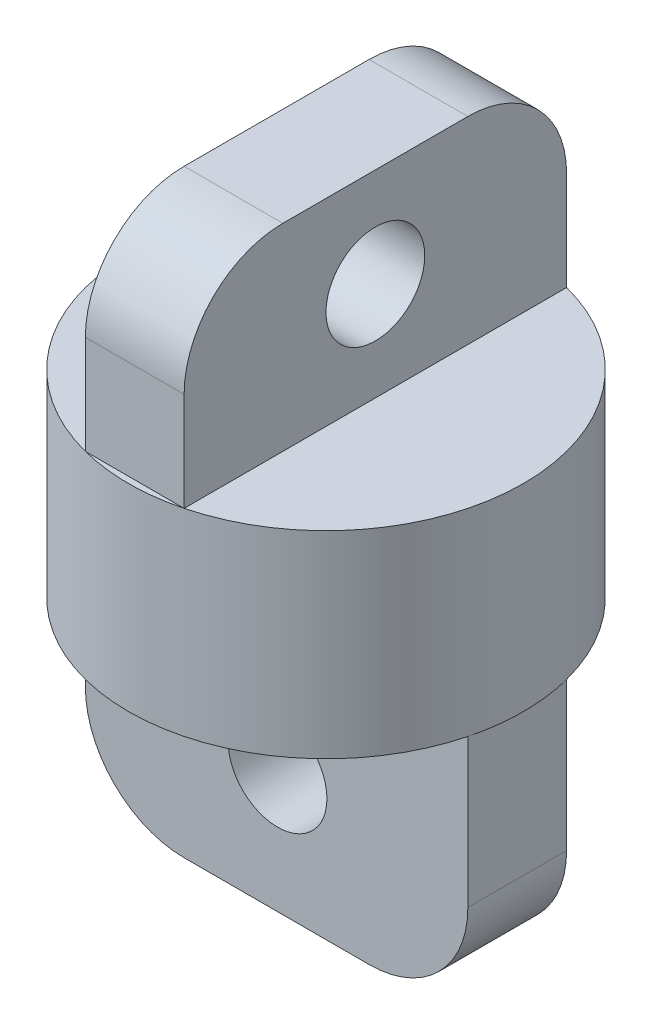
ISO-10303-21;
HEADER;
FILE_DESCRIPTION(('STEP AP214'),'2;1');
FILE_NAME('part.step','',(''),(''),'','','');
FILE_SCHEMA(('AUTOMOTIVE_DESIGN { 1 0 10303 214 1 1 1 1 }'));
ENDSEC;
DATA;
#1=APPLICATION_CONTEXT('core data for automotive mechanical design processes');
#2=APPLICATION_PROTOCOL_DEFINITION('international standard','automotive_design',2000,#1);
#3=PRODUCT_CONTEXT('',#1,'mechanical');
#4=PRODUCT('Part','Part','',(#3));
#5=PRODUCT_RELATED_PRODUCT_CATEGORY('part','',(#4));
#6=PRODUCT_DEFINITION_FORMATION('','',#4);
#7=PRODUCT_DEFINITION_CONTEXT('part definition',#1,'design');
#8=PRODUCT_DEFINITION('design','',#6,#7);
#9=PRODUCT_DEFINITION_SHAPE('','',#8);
#10=(LENGTH_UNIT() NAMED_UNIT(*) SI_UNIT(.MILLI.,.METRE.));
#11=(NAMED_UNIT(*) PLANE_ANGLE_UNIT() SI_UNIT($,.RADIAN.));
#12=(NAMED_UNIT(*) SI_UNIT($,.STERADIAN.) SOLID_ANGLE_UNIT());
#13=UNCERTAINTY_MEASURE_WITH_UNIT(LENGTH_MEASURE(1.E-05),#10,'distance_accuracy_value','');
#14=(GEOMETRIC_REPRESENTATION_CONTEXT(3) GLOBAL_UNCERTAINTY_ASSIGNED_CONTEXT((#13)) GLOBAL_UNIT_ASSIGNED_CONTEXT((#10,
#11,#12)) REPRESENTATION_CONTEXT('',''));
#15=CARTESIAN_POINT('',(0.,0.,0.));
#16=DIRECTION('',(0.,0.,1.));
#17=DIRECTION('',(1.,0.,0.));
#18=AXIS2_PLACEMENT_3D('',#15,#16,#17);
#19=CARTESIAN_POINT('',(0.,50.8,0.));
#20=DIRECTION('',(0.,1.,0.));
#21=DIRECTION('',(0.,0.,1.));
#22=AXIS2_PLACEMENT_3D('',#19,#20,#21);
#23=PLANE('',#22);
#24=DIRECTION('',(0.,0.,-1.));
#25=VECTOR('',#24,1.);
#26=CARTESIAN_POINT('',(12.7,50.8,49.1868884968342));
#27=LINE('',#26,#25);
#28=CARTESIAN_POINT('',(12.7,50.8,49.1868884968342));
#29=VERTEX_POINT('',#28);
#30=CARTESIAN_POINT('',(12.7,50.8,-49.1868884968342));
#31=VERTEX_POINT('',#30);
#32=EDGE_CURVE('E174',#29,#31,#27,.T.);
#33=ORIENTED_EDGE('',*,*,#32,.F.);
#34=CARTESIAN_POINT('',(0.,50.8,0.));
#35=DIRECTION('',(0.,1.,0.));
#36=DIRECTION('',(0.,0.,1.));
#37=AXIS2_PLACEMENT_3D('',#34,#35,#36);
#38=CIRCLE('',#37,50.8);
#39=EDGE_CURVE('E156',#29,#31,#38,.T.);
#40=ORIENTED_EDGE('',*,*,#39,.T.);
#41=EDGE_LOOP('',(#33,#40));
#42=FACE_BOUND('',#41,.T.);
#43=ADVANCED_FACE('F45',(#42),#23,.T.);
#44=DIRECTION('',(1.,0.,0.));
#45=VECTOR('',#44,1.);
#46=CARTESIAN_POINT('',(-12.7,50.8,49.1868884968342));
#47=LINE('',#46,#45);
#48=CARTESIAN_POINT('',(-12.7,50.8,49.1868884968342));
#49=VERTEX_POINT('',#48);
#50=EDGE_CURVE('E169',#49,#29,#47,.T.);
#51=ORIENTED_EDGE('',*,*,#50,.F.);
#52=EDGE_CURVE('E164',#49,#29,#38,.T.);
#53=ORIENTED_EDGE('',*,*,#52,.T.);
#54=EDGE_LOOP('',(#51,#53));
#55=FACE_BOUND('',#54,.T.);
#56=ADVANCED_FACE('F310',(#55),#23,.T.);
#57=DIRECTION('',(0.,0.,1.));
#58=VECTOR('',#57,1.);
#59=CARTESIAN_POINT('',(-12.7,50.8,49.1868884968342));
#60=LINE('',#59,#58);
#61=CARTESIAN_POINT('',(-12.7,50.8,-49.1868884968342));
#62=VERTEX_POINT('',#61);
#63=EDGE_CURVE('E137',#62,#49,#60,.T.);
#64=ORIENTED_EDGE('',*,*,#63,.F.);
#65=EDGE_CURVE('E157',#62,#49,#38,.T.);
#66=ORIENTED_EDGE('',*,*,#65,.T.);
#67=EDGE_LOOP('',(#64,#66));
#68=FACE_BOUND('',#67,.T.);
#69=ADVANCED_FACE('F167',(#68),#23,.T.);
#70=CARTESIAN_POINT('',(0.,0.,0.));
#71=DIRECTION('',(0.,1.,0.));
#72=DIRECTION('',(0.,0.,1.));
#73=AXIS2_PLACEMENT_3D('',#70,#71,#72);
#74=PLANE('',#73);
#75=DIRECTION('',(0.,0.,1.));
#76=VECTOR('',#75,1.);
#77=CARTESIAN_POINT('',(49.1868884968342,0.,-12.7));
#78=LINE('',#77,#76);
#79=CARTESIAN_POINT('',(49.1868884968342,0.,-12.7));
#80=VERTEX_POINT('',#79);
#81=CARTESIAN_POINT('',(49.1868884968342,0.,12.7));
#82=VERTEX_POINT('',#81);
#83=EDGE_CURVE('E208',#80,#82,#78,.T.);
#84=ORIENTED_EDGE('',*,*,#83,.F.);
#85=CARTESIAN_POINT('',(0.,0.,0.));
#86=DIRECTION('',(0.,1.,0.));
#87=DIRECTION('',(0.,0.,1.));
#88=AXIS2_PLACEMENT_3D('',#85,#86,#87);
#89=CIRCLE('',#88,50.8);
#90=EDGE_CURVE('E237',#82,#80,#89,.T.);
#91=ORIENTED_EDGE('',*,*,#90,.F.);
#92=EDGE_LOOP('',(#84,#91));
#93=FACE_BOUND('',#92,.T.);
#94=ADVANCED_FACE('F340',(#93),#74,.F.);
#95=DIRECTION('',(1.,0.,0.));
#96=VECTOR('',#95,1.);
#97=CARTESIAN_POINT('',(-49.1868884968342,0.,-12.7));
#98=LINE('',#97,#96);
#99=CARTESIAN_POINT('',(-49.1868884968342,0.,-12.7000000000001));
#100=VERTEX_POINT('',#99);
#101=EDGE_CURVE('E203',#100,#80,#98,.T.);
#102=ORIENTED_EDGE('',*,*,#101,.F.);
#103=EDGE_CURVE('E241',#80,#100,#89,.T.);
#104=ORIENTED_EDGE('',*,*,#103,.F.);
#105=EDGE_LOOP('',(#102,#104));
#106=FACE_BOUND('',#105,.T.);
#107=ADVANCED_FACE('F344',(#106),#74,.F.);
#108=DIRECTION('',(0.,0.,-1.));
#109=VECTOR('',#108,1.);
#110=CARTESIAN_POINT('',(-49.1868884968342,0.,-12.7));
#111=LINE('',#110,#109);
#112=CARTESIAN_POINT('',(-49.1868884968342,0.,12.7));
#113=VERTEX_POINT('',#112);
#114=EDGE_CURVE('E216',#113,#100,#111,.T.);
#115=ORIENTED_EDGE('',*,*,#114,.F.);
#116=EDGE_CURVE('E369',#100,#113,#89,.T.);
#117=ORIENTED_EDGE('',*,*,#116,.F.);
#118=EDGE_LOOP('',(#115,#117));
#119=FACE_BOUND('',#118,.T.);
#120=ADVANCED_FACE('F349',(#119),#74,.F.);
#121=DIRECTION('',(-1.,0.,0.));
#122=VECTOR('',#121,1.);
#123=CARTESIAN_POINT('',(-49.1868884968342,0.,12.7));
#124=LINE('',#123,#122);
#125=EDGE_CURVE('E212',#82,#113,#124,.T.);
#126=ORIENTED_EDGE('',*,*,#125,.F.);
#127=EDGE_CURVE('E233',#113,#82,#89,.T.);
#128=ORIENTED_EDGE('',*,*,#127,.F.);
#129=EDGE_LOOP('',(#126,#128));
#130=FACE_BOUND('',#129,.T.);
#131=ADVANCED_FACE('F337',(#130),#74,.F.);
#132=CARTESIAN_POINT('',(0.,50.8,0.));
#133=DIRECTION('',(0.,-1.,0.));
#134=DIRECTION('',(0.,0.,-1.));
#135=AXIS2_PLACEMENT_3D('',#132,#133,#134);
#136=CYLINDRICAL_SURFACE('',#135,50.8);
#137=ORIENTED_EDGE('',*,*,#39,.F.);
#138=ORIENTED_EDGE('',*,*,#52,.F.);
#139=ORIENTED_EDGE('',*,*,#65,.F.);
#140=EDGE_CURVE('E148',#31,#62,#38,.T.);
#141=ORIENTED_EDGE('',*,*,#140,.F.);
#142=EDGE_LOOP('',(#137,#138,#139,#141));
#143=FACE_BOUND('',#142,.T.);
#144=ORIENTED_EDGE('',*,*,#90,.T.);
#145=ORIENTED_EDGE('',*,*,#103,.T.);
#146=ORIENTED_EDGE('',*,*,#116,.T.);
#147=ORIENTED_EDGE('',*,*,#127,.T.);
#148=EDGE_LOOP('',(#144,#145,#146,#147));
#149=FACE_BOUND('',#148,.T.);
#150=ADVANCED_FACE('F161',(#143,#149),#136,.T.);
#151=DIRECTION('',(-1.,0.,0.));
#152=VECTOR('',#151,1.);
#153=CARTESIAN_POINT('',(-12.7,50.8,-49.1868884968342));
#154=LINE('',#153,#152);
#155=EDGE_CURVE('E151',#31,#62,#154,.T.);
#156=ORIENTED_EDGE('',*,*,#155,.F.);
#157=ORIENTED_EDGE('',*,*,#140,.T.);
#158=EDGE_LOOP('',(#156,#157));
#159=FACE_BOUND('',#158,.T.);
#160=ADVANCED_FACE('F150',(#159),#23,.T.);
#161=CARTESIAN_POINT('',(49.1868884968342,-63.5,-12.7));
#162=DIRECTION('',(-1.,0.,0.));
#163=DIRECTION('',(0.,0.,1.));
#164=AXIS2_PLACEMENT_3D('',#161,#162,#163);
#165=PLANE('',#164);
#166=DIRECTION('',(0.,1.,0.));
#167=VECTOR('',#166,1.);
#168=CARTESIAN_POINT('',(49.1868884968342,-63.5,12.7));
#169=LINE('',#168,#167);
#170=CARTESIAN_POINT('',(49.1868884968342,-38.1,12.7));
#171=VERTEX_POINT('',#170);
#172=EDGE_CURVE('E231',#171,#82,#169,.T.);
#173=ORIENTED_EDGE('',*,*,#172,.F.);
#174=DIRECTION('',(0.,0.,1.));
#175=VECTOR('',#174,1.);
#176=CARTESIAN_POINT('',(49.1868884968342,-38.1,-12.7));
#177=LINE('',#176,#175);
#178=CARTESIAN_POINT('',(49.1868884968342,-38.1,-12.7));
#179=VERTEX_POINT('',#178);
#180=EDGE_CURVE('E265',#171,#179,#177,.F.);
#181=ORIENTED_EDGE('',*,*,#180,.T.);
#182=DIRECTION('',(0.,1.,0.));
#183=VECTOR('',#182,1.);
#184=CARTESIAN_POINT('',(49.1868884968342,-63.5,-12.7));
#185=LINE('',#184,#183);
#186=EDGE_CURVE('E207',#179,#80,#185,.T.);
#187=ORIENTED_EDGE('',*,*,#186,.T.);
#188=ORIENTED_EDGE('',*,*,#83,.T.);
#189=EDGE_LOOP('',(#173,#181,#187,#188));
#190=FACE_BOUND('',#189,.T.);
#191=ADVANCED_FACE('F329',(#190),#165,.F.);
#192=CARTESIAN_POINT('',(-49.1868884968342,-63.5,12.7));
#193=DIRECTION('',(0.,0.,-1.));
#194=DIRECTION('',(-1.,0.,0.));
#195=AXIS2_PLACEMENT_3D('',#192,#193,#194);
#196=PLANE('',#195);
#197=CARTESIAN_POINT('',(0.243990195886043,-31.9670642886024,12.7));
#198=DIRECTION('',(0.,0.,1.));
#199=DIRECTION('',(1.,0.,0.));
#200=AXIS2_PLACEMENT_3D('',#197,#198,#199);
#201=CIRCLE('',#200,12.7);
#202=CARTESIAN_POINT('',(12.943990195886,-31.9670642886024,12.7));
#203=VERTEX_POINT('',#202);
#204=EDGE_CURVE('E194',#203,#203,#201,.T.);
#205=ORIENTED_EDGE('',*,*,#204,.F.);
#206=EDGE_LOOP('',(#205));
#207=FACE_BOUND('',#206,.T.);
#208=DIRECTION('',(-1.,0.,0.));
#209=VECTOR('',#208,1.);
#210=CARTESIAN_POINT('',(-49.1868884968342,-63.5,12.7));
#211=LINE('',#210,#209);
#212=CARTESIAN_POINT('',(23.7868884968342,-63.5,12.7));
#213=VERTEX_POINT('',#212);
#214=CARTESIAN_POINT('',(-23.7868884968342,-63.5,12.7));
#215=VERTEX_POINT('',#214);
#216=EDGE_CURVE('E199',#213,#215,#211,.T.);
#217=ORIENTED_EDGE('',*,*,#216,.F.);
#218=CARTESIAN_POINT('',(23.7868884968342,-38.1,12.7));
#219=DIRECTION('',(0.,0.,-1.));
#220=DIRECTION('',(-1.,0.,0.));
#221=AXIS2_PLACEMENT_3D('',#218,#219,#220);
#222=CIRCLE('',#221,25.4);
#223=EDGE_CURVE('E262',#213,#171,#222,.F.);
#224=ORIENTED_EDGE('',*,*,#223,.T.);
#225=ORIENTED_EDGE('',*,*,#172,.T.);
#226=ORIENTED_EDGE('',*,*,#125,.T.);
#227=DIRECTION('',(0.,1.,0.));
#228=VECTOR('',#227,1.);
#229=CARTESIAN_POINT('',(-49.1868884968342,-63.5,12.7));
#230=LINE('',#229,#228);
#231=CARTESIAN_POINT('',(-49.1868884968342,-38.1,12.7));
#232=VERTEX_POINT('',#231);
#233=EDGE_CURVE('E228',#232,#113,#230,.T.);
#234=ORIENTED_EDGE('',*,*,#233,.F.);
#235=CARTESIAN_POINT('',(-23.7868884968342,-38.1,12.7));
#236=DIRECTION('',(0.,0.,-1.));
#237=DIRECTION('',(-1.,0.,0.));
#238=AXIS2_PLACEMENT_3D('',#235,#236,#237);
#239=CIRCLE('',#238,25.4);
#240=EDGE_CURVE('E254',#232,#215,#239,.F.);
#241=ORIENTED_EDGE('',*,*,#240,.T.);
#242=EDGE_LOOP('',(#217,#224,#225,#226,#234,#241));
#243=FACE_BOUND('',#242,.T.);
#244=ADVANCED_FACE('F335',(#207,#243),#196,.F.);
#245=CARTESIAN_POINT('',(-49.1868884968342,-63.5,-12.7));
#246=DIRECTION('',(1.,0.,0.));
#247=DIRECTION('',(0.,0.,-1.));
#248=AXIS2_PLACEMENT_3D('',#245,#246,#247);
#249=PLANE('',#248);
#250=DIRECTION('',(0.,1.,0.));
#251=VECTOR('',#250,1.);
#252=CARTESIAN_POINT('',(-49.1868884968342,-63.5,-12.7));
#253=LINE('',#252,#251);
#254=CARTESIAN_POINT('',(-49.1868884968342,-38.1,-12.7));
#255=VERTEX_POINT('',#254);
#256=EDGE_CURVE('E225',#255,#100,#253,.T.);
#257=ORIENTED_EDGE('',*,*,#256,.F.);
#258=DIRECTION('',(0.,0.,-1.));
#259=VECTOR('',#258,1.);
#260=CARTESIAN_POINT('',(-49.1868884968342,-38.1,-12.7));
#261=LINE('',#260,#259);
#262=EDGE_CURVE('E251',#255,#232,#261,.F.);
#263=ORIENTED_EDGE('',*,*,#262,.T.);
#264=ORIENTED_EDGE('',*,*,#233,.T.);
#265=ORIENTED_EDGE('',*,*,#114,.T.);
#266=EDGE_LOOP('',(#257,#263,#264,#265));
#267=FACE_BOUND('',#266,.T.);
#268=ADVANCED_FACE('F393',(#267),#249,.F.);
#269=CARTESIAN_POINT('',(-49.1868884968342,-63.5,-12.7));
#270=DIRECTION('',(0.,0.,1.));
#271=DIRECTION('',(1.,0.,0.));
#272=AXIS2_PLACEMENT_3D('',#269,#270,#271);
#273=PLANE('',#272);
#274=CARTESIAN_POINT('',(0.243990195886043,-31.9670642886024,-12.7));
#275=DIRECTION('',(0.,0.,1.));
#276=DIRECTION('',(1.,0.,0.));
#277=AXIS2_PLACEMENT_3D('',#274,#275,#276);
#278=CIRCLE('',#277,12.7);
#279=CARTESIAN_POINT('',(12.943990195886,-31.9670642886024,-12.7));
#280=VERTEX_POINT('',#279);
#281=EDGE_CURVE('E198',#280,#280,#278,.T.);
#282=ORIENTED_EDGE('',*,*,#281,.T.);
#283=EDGE_LOOP('',(#282));
#284=FACE_BOUND('',#283,.T.);
#285=ORIENTED_EDGE('',*,*,#186,.F.);
#286=CARTESIAN_POINT('',(23.7868884968342,-38.1,-12.7));
#287=DIRECTION('',(0.,0.,1.));
#288=DIRECTION('',(1.,0.,0.));
#289=AXIS2_PLACEMENT_3D('',#286,#287,#288);
#290=CIRCLE('',#289,25.4);
#291=CARTESIAN_POINT('',(23.7868884968342,-63.5,-12.7));
#292=VERTEX_POINT('',#291);
#293=EDGE_CURVE('E268',#179,#292,#290,.F.);
#294=ORIENTED_EDGE('',*,*,#293,.T.);
#295=DIRECTION('',(1.,0.,0.));
#296=VECTOR('',#295,1.);
#297=CARTESIAN_POINT('',(-49.1868884968342,-63.5,-12.7));
#298=LINE('',#297,#296);
#299=CARTESIAN_POINT('',(-23.7868884968342,-63.5,-12.7));
#300=VERTEX_POINT('',#299);
#301=EDGE_CURVE('E202',#300,#292,#298,.T.);
#302=ORIENTED_EDGE('',*,*,#301,.F.);
#303=CARTESIAN_POINT('',(-23.7868884968342,-38.1,-12.7));
#304=DIRECTION('',(0.,0.,1.));
#305=DIRECTION('',(1.,0.,0.));
#306=AXIS2_PLACEMENT_3D('',#303,#304,#305);
#307=CIRCLE('',#306,25.4);
#308=EDGE_CURVE('E248',#300,#255,#307,.F.);
#309=ORIENTED_EDGE('',*,*,#308,.T.);
#310=ORIENTED_EDGE('',*,*,#256,.T.);
#311=ORIENTED_EDGE('',*,*,#101,.T.);
#312=EDGE_LOOP('',(#285,#294,#302,#309,#310,#311));
#313=FACE_BOUND('',#312,.T.);
#314=ADVANCED_FACE('F377',(#284,#313),#273,.F.);
#315=CARTESIAN_POINT('',(0.,-63.5,0.));
#316=DIRECTION('',(0.,1.,0.));
#317=DIRECTION('',(0.,0.,1.));
#318=AXIS2_PLACEMENT_3D('',#315,#316,#317);
#319=PLANE('',#318);
#320=ORIENTED_EDGE('',*,*,#301,.T.);
#321=DIRECTION('',(0.,0.,1.));
#322=VECTOR('',#321,1.);
#323=CARTESIAN_POINT('',(23.7868884968342,-63.5,0.));
#324=LINE('',#323,#322);
#325=EDGE_CURVE('E258',#292,#213,#324,.T.);
#326=ORIENTED_EDGE('',*,*,#325,.T.);
#327=ORIENTED_EDGE('',*,*,#216,.T.);
#328=DIRECTION('',(0.,0.,-1.));
#329=VECTOR('',#328,1.);
#330=CARTESIAN_POINT('',(-23.7868884968342,-63.5,0.));
#331=LINE('',#330,#329);
#332=EDGE_CURVE('E236',#215,#300,#331,.T.);
#333=ORIENTED_EDGE('',*,*,#332,.T.);
#334=EDGE_LOOP('',(#320,#326,#327,#333));
#335=FACE_BOUND('',#334,.T.);
#336=ADVANCED_FACE('F385',(#335),#319,.F.);
#337=CARTESIAN_POINT('',(0.243990195886043,-31.9670642886024,-50.8));
#338=DIRECTION('',(0.,0.,1.));
#339=DIRECTION('',(1.,0.,0.));
#340=AXIS2_PLACEMENT_3D('',#337,#338,#339);
#341=CYLINDRICAL_SURFACE('',#340,12.7);
#342=ORIENTED_EDGE('',*,*,#204,.T.);
#343=EDGE_LOOP('',(#342));
#344=FACE_BOUND('',#343,.T.);
#345=ORIENTED_EDGE('',*,*,#281,.F.);
#346=EDGE_LOOP('',(#345));
#347=FACE_BOUND('',#346,.T.);
#348=ADVANCED_FACE('F414',(#344,#347),#341,.F.);
#349=CARTESIAN_POINT('',(-23.7868884968342,-38.1,0.));
#350=DIRECTION('',(0.,0.,-1.));
#351=DIRECTION('',(-1.,0.,0.));
#352=AXIS2_PLACEMENT_3D('',#349,#350,#351);
#353=CYLINDRICAL_SURFACE('',#352,25.4);
#354=ORIENTED_EDGE('',*,*,#240,.F.);
#355=ORIENTED_EDGE('',*,*,#262,.F.);
#356=ORIENTED_EDGE('',*,*,#308,.F.);
#357=ORIENTED_EDGE('',*,*,#332,.F.);
#358=EDGE_LOOP('',(#354,#355,#356,#357));
#359=FACE_BOUND('',#358,.T.);
#360=ADVANCED_FACE('F390',(#359),#353,.T.);
#361=CARTESIAN_POINT('',(23.7868884968342,-38.1,0.));
#362=DIRECTION('',(0.,0.,1.));
#363=DIRECTION('',(1.,0.,0.));
#364=AXIS2_PLACEMENT_3D('',#361,#362,#363);
#365=CYLINDRICAL_SURFACE('',#364,25.4);
#366=ORIENTED_EDGE('',*,*,#293,.F.);
#367=ORIENTED_EDGE('',*,*,#180,.F.);
#368=ORIENTED_EDGE('',*,*,#223,.F.);
#369=ORIENTED_EDGE('',*,*,#325,.F.);
#370=EDGE_LOOP('',(#366,#367,#368,#369));
#371=FACE_BOUND('',#370,.T.);
#372=ADVANCED_FACE('F382',(#371),#365,.T.);
#373=CARTESIAN_POINT('',(12.7,101.6,49.1868884968342));
#374=DIRECTION('',(-1.,0.,0.));
#375=DIRECTION('',(0.,0.,1.));
#376=AXIS2_PLACEMENT_3D('',#373,#374,#375);
#377=PLANE('',#376);
#378=CARTESIAN_POINT('',(12.7,76.2,0.));
#379=DIRECTION('',(1.,0.,0.));
#380=DIRECTION('',(0.,0.,-1.));
#381=AXIS2_PLACEMENT_3D('',#378,#379,#380);
#382=CIRCLE('',#381,12.7);
#383=CARTESIAN_POINT('',(12.7,76.2,-12.7));
#384=VERTEX_POINT('',#383);
#385=EDGE_CURVE('E275',#384,#384,#382,.T.);
#386=ORIENTED_EDGE('',*,*,#385,.F.);
#387=EDGE_LOOP('',(#386));
#388=FACE_BOUND('',#387,.T.);
#389=DIRECTION('',(0.,0.,-1.));
#390=VECTOR('',#389,1.);
#391=CARTESIAN_POINT('',(12.7,101.6,49.1868884968342));
#392=LINE('',#391,#390);
#393=CARTESIAN_POINT('',(12.7,101.6,23.7868884968342));
#394=VERTEX_POINT('',#393);
#395=CARTESIAN_POINT('',(12.7,101.6,-23.7868884968342));
#396=VERTEX_POINT('',#395);
#397=EDGE_CURVE('E185',#394,#396,#392,.T.);
#398=ORIENTED_EDGE('',*,*,#397,.F.);
#399=CARTESIAN_POINT('',(12.7,76.2,23.7868884968342));
#400=DIRECTION('',(-1.,0.,0.));
#401=DIRECTION('',(0.,0.,1.));
#402=AXIS2_PLACEMENT_3D('',#399,#400,#401);
#403=CIRCLE('',#402,25.4);
#404=CARTESIAN_POINT('',(12.7,76.2,49.1868884968342));
#405=VERTEX_POINT('',#404);
#406=EDGE_CURVE('E286',#394,#405,#403,.F.);
#407=ORIENTED_EDGE('',*,*,#406,.T.);
#408=DIRECTION('',(0.,-1.,0.));
#409=VECTOR('',#408,1.);
#410=CARTESIAN_POINT('',(12.7,101.6,49.1868884968342));
#411=LINE('',#410,#409);
#412=EDGE_CURVE('E186',#405,#29,#411,.T.);
#413=ORIENTED_EDGE('',*,*,#412,.T.);
#414=ORIENTED_EDGE('',*,*,#32,.T.);
#415=DIRECTION('',(0.,-1.,0.));
#416=VECTOR('',#415,1.);
#417=CARTESIAN_POINT('',(12.7,101.6,-49.1868884968342));
#418=LINE('',#417,#416);
#419=CARTESIAN_POINT('',(12.7,76.2,-49.1868884968342));
#420=VERTEX_POINT('',#419);
#421=EDGE_CURVE('E142',#420,#31,#418,.T.);
#422=ORIENTED_EDGE('',*,*,#421,.F.);
#423=CARTESIAN_POINT('',(12.7,76.2,-23.7868884968342));
#424=DIRECTION('',(-1.,0.,0.));
#425=DIRECTION('',(0.,0.,1.));
#426=AXIS2_PLACEMENT_3D('',#423,#424,#425);
#427=CIRCLE('',#426,25.4);
#428=EDGE_CURVE('E283',#420,#396,#427,.F.);
#429=ORIENTED_EDGE('',*,*,#428,.T.);
#430=EDGE_LOOP('',(#398,#407,#413,#414,#422,#429));
#431=FACE_BOUND('',#430,.T.);
#432=ADVANCED_FACE('F305',(#388,#431),#377,.F.);
#433=CARTESIAN_POINT('',(-12.7,101.6,-49.1868884968342));
#434=DIRECTION('',(0.,0.,1.));
#435=DIRECTION('',(1.,0.,0.));
#436=AXIS2_PLACEMENT_3D('',#433,#434,#435);
#437=PLANE('',#436);
#438=DIRECTION('',(0.,-1.,0.));
#439=VECTOR('',#438,1.);
#440=CARTESIAN_POINT('',(-12.7,101.6,-49.1868884968342));
#441=LINE('',#440,#439);
#442=CARTESIAN_POINT('',(-12.7,76.2,-49.1868884968342));
#443=VERTEX_POINT('',#442);
#444=EDGE_CURVE('E133',#443,#62,#441,.T.);
#445=ORIENTED_EDGE('',*,*,#444,.F.);
#446=DIRECTION('',(-1.,0.,0.));
#447=VECTOR('',#446,1.);
#448=CARTESIAN_POINT('',(-12.7,76.2,-49.1868884968342));
#449=LINE('',#448,#447);
#450=EDGE_CURVE('E11',#443,#420,#449,.F.);
#451=ORIENTED_EDGE('',*,*,#450,.T.);
#452=ORIENTED_EDGE('',*,*,#421,.T.);
#453=ORIENTED_EDGE('',*,*,#155,.T.);
#454=EDGE_LOOP('',(#445,#451,#452,#453));
#455=FACE_BOUND('',#454,.T.);
#456=ADVANCED_FACE('F171',(#455),#437,.F.);
#457=CARTESIAN_POINT('',(-12.7,101.6,49.1868884968342));
#458=DIRECTION('',(1.,0.,0.));
#459=DIRECTION('',(0.,0.,-1.));
#460=AXIS2_PLACEMENT_3D('',#457,#458,#459);
#461=PLANE('',#460);
#462=CARTESIAN_POINT('',(-12.7,76.2,0.));
#463=DIRECTION('',(1.,0.,0.));
#464=DIRECTION('',(0.,0.,-1.));
#465=AXIS2_PLACEMENT_3D('',#462,#463,#464);
#466=CIRCLE('',#465,12.7);
#467=CARTESIAN_POINT('',(-12.7,76.2,-12.7));
#468=VERTEX_POINT('',#467);
#469=EDGE_CURVE('E178',#468,#468,#466,.T.);
#470=ORIENTED_EDGE('',*,*,#469,.T.);
#471=EDGE_LOOP('',(#470));
#472=FACE_BOUND('',#471,.T.);
#473=DIRECTION('',(0.,-1.,0.));
#474=VECTOR('',#473,1.);
#475=CARTESIAN_POINT('',(-12.7,101.6,49.1868884968342));
#476=LINE('',#475,#474);
#477=CARTESIAN_POINT('',(-12.7,76.2,49.1868884968342));
#478=VERTEX_POINT('',#477);
#479=EDGE_CURVE('E143',#478,#49,#476,.T.);
#480=ORIENTED_EDGE('',*,*,#479,.F.);
#481=CARTESIAN_POINT('',(-12.7,76.2,23.7868884968342));
#482=DIRECTION('',(1.,0.,0.));
#483=DIRECTION('',(0.,0.,-1.));
#484=AXIS2_PLACEMENT_3D('',#481,#482,#483);
#485=CIRCLE('',#484,25.4);
#486=CARTESIAN_POINT('',(-12.7,101.6,23.7868884968342));
#487=VERTEX_POINT('',#486);
#488=EDGE_CURVE('E54',#478,#487,#485,.F.);
#489=ORIENTED_EDGE('',*,*,#488,.T.);
#490=DIRECTION('',(0.,0.,1.));
#491=VECTOR('',#490,1.);
#492=CARTESIAN_POINT('',(-12.7,101.6,49.1868884968342));
#493=LINE('',#492,#491);
#494=CARTESIAN_POINT('',(-12.7,101.6,-23.7868884968342));
#495=VERTEX_POINT('',#494);
#496=EDGE_CURVE('E189',#495,#487,#493,.T.);
#497=ORIENTED_EDGE('',*,*,#496,.F.);
#498=CARTESIAN_POINT('',(-12.7,76.2,-23.7868884968342));
#499=DIRECTION('',(1.,0.,0.));
#500=DIRECTION('',(0.,0.,-1.));
#501=AXIS2_PLACEMENT_3D('',#498,#499,#500);
#502=CIRCLE('',#501,25.4);
#503=EDGE_CURVE('E61',#495,#443,#502,.F.);
#504=ORIENTED_EDGE('',*,*,#503,.T.);
#505=ORIENTED_EDGE('',*,*,#444,.T.);
#506=ORIENTED_EDGE('',*,*,#63,.T.);
#507=EDGE_LOOP('',(#480,#489,#497,#504,#505,#506));
#508=FACE_BOUND('',#507,.T.);
#509=ADVANCED_FACE('F135',(#472,#508),#461,.F.);
#510=CARTESIAN_POINT('',(-12.7,101.6,49.1868884968342));
#511=DIRECTION('',(0.,0.,-1.));
#512=DIRECTION('',(-1.,0.,0.));
#513=AXIS2_PLACEMENT_3D('',#510,#511,#512);
#514=PLANE('',#513);
#515=ORIENTED_EDGE('',*,*,#412,.F.);
#516=DIRECTION('',(1.,0.,0.));
#517=VECTOR('',#516,1.);
#518=CARTESIAN_POINT('',(-12.7,76.2,49.1868884968342));
#519=LINE('',#518,#517);
#520=EDGE_CURVE('E69',#405,#478,#519,.F.);
#521=ORIENTED_EDGE('',*,*,#520,.T.);
#522=ORIENTED_EDGE('',*,*,#479,.T.);
#523=ORIENTED_EDGE('',*,*,#50,.T.);
#524=EDGE_LOOP('',(#515,#521,#522,#523));
#525=FACE_BOUND('',#524,.T.);
#526=ADVANCED_FACE('F307',(#525),#514,.F.);
#527=CARTESIAN_POINT('',(0.,101.6,0.));
#528=DIRECTION('',(0.,-1.,0.));
#529=DIRECTION('',(0.,0.,-1.));
#530=AXIS2_PLACEMENT_3D('',#527,#528,#529);
#531=PLANE('',#530);
#532=ORIENTED_EDGE('',*,*,#496,.T.);
#533=DIRECTION('',(1.,0.,0.));
#534=VECTOR('',#533,1.);
#535=CARTESIAN_POINT('',(0.,101.6,23.7868884968342));
#536=LINE('',#535,#534);
#537=EDGE_CURVE('E279',#487,#394,#536,.T.);
#538=ORIENTED_EDGE('',*,*,#537,.T.);
#539=ORIENTED_EDGE('',*,*,#397,.T.);
#540=DIRECTION('',(-1.,0.,0.));
#541=VECTOR('',#540,1.);
#542=CARTESIAN_POINT('',(0.,101.6,-23.7868884968342));
#543=LINE('',#542,#541);
#544=EDGE_CURVE('E271',#396,#495,#543,.T.);
#545=ORIENTED_EDGE('',*,*,#544,.T.);
#546=EDGE_LOOP('',(#532,#538,#539,#545));
#547=FACE_BOUND('',#546,.T.);
#548=ADVANCED_FACE('F298',(#547),#531,.F.);
#549=CARTESIAN_POINT('',(-38.1,76.2,0.));
#550=DIRECTION('',(1.,0.,0.));
#551=DIRECTION('',(0.,0.,-1.));
#552=AXIS2_PLACEMENT_3D('',#549,#550,#551);
#553=CYLINDRICAL_SURFACE('',#552,12.7);
#554=ORIENTED_EDGE('',*,*,#385,.T.);
#555=EDGE_LOOP('',(#554));
#556=FACE_BOUND('',#555,.T.);
#557=ORIENTED_EDGE('',*,*,#469,.F.);
#558=EDGE_LOOP('',(#557));
#559=FACE_BOUND('',#558,.T.);
#560=ADVANCED_FACE('F319',(#556,#559),#553,.F.);
#561=CARTESIAN_POINT('',(0.,76.2,23.7868884968342));
#562=DIRECTION('',(1.,0.,0.));
#563=DIRECTION('',(0.,0.,-1.));
#564=AXIS2_PLACEMENT_3D('',#561,#562,#563);
#565=CYLINDRICAL_SURFACE('',#564,25.4);
#566=ORIENTED_EDGE('',*,*,#488,.F.);
#567=ORIENTED_EDGE('',*,*,#520,.F.);
#568=ORIENTED_EDGE('',*,*,#406,.F.);
#569=ORIENTED_EDGE('',*,*,#537,.F.);
#570=EDGE_LOOP('',(#566,#567,#568,#569));
#571=FACE_BOUND('',#570,.T.);
#572=ADVANCED_FACE('F303',(#571),#565,.T.);
#573=CARTESIAN_POINT('',(0.,76.2,-23.7868884968342));
#574=DIRECTION('',(-1.,0.,0.));
#575=DIRECTION('',(0.,0.,1.));
#576=AXIS2_PLACEMENT_3D('',#573,#574,#575);
#577=CYLINDRICAL_SURFACE('',#576,25.4);
#578=ORIENTED_EDGE('',*,*,#428,.F.);
#579=ORIENTED_EDGE('',*,*,#450,.F.);
#580=ORIENTED_EDGE('',*,*,#503,.F.);
#581=ORIENTED_EDGE('',*,*,#544,.F.);
#582=EDGE_LOOP('',(#578,#579,#580,#581));
#583=FACE_BOUND('',#582,.T.);
#584=ADVANCED_FACE('F47',(#583),#577,.T.);
#585=CLOSED_SHELL('',(#43,#56,#69,#94,#107,#120,#131,#150,#160,#191,#244,#268,#314,#336,#348,
#360,#372,#432,#456,#509,#526,#548,#560,#572,#584));
#586=MANIFOLD_SOLID_BREP('B2',#585);
#587=ADVANCED_BREP_SHAPE_REPRESENTATION('',(#18,#586),#14);
#588=SHAPE_DEFINITION_REPRESENTATION(#9,#587);
ENDSEC;
END-ISO-10303-21;
